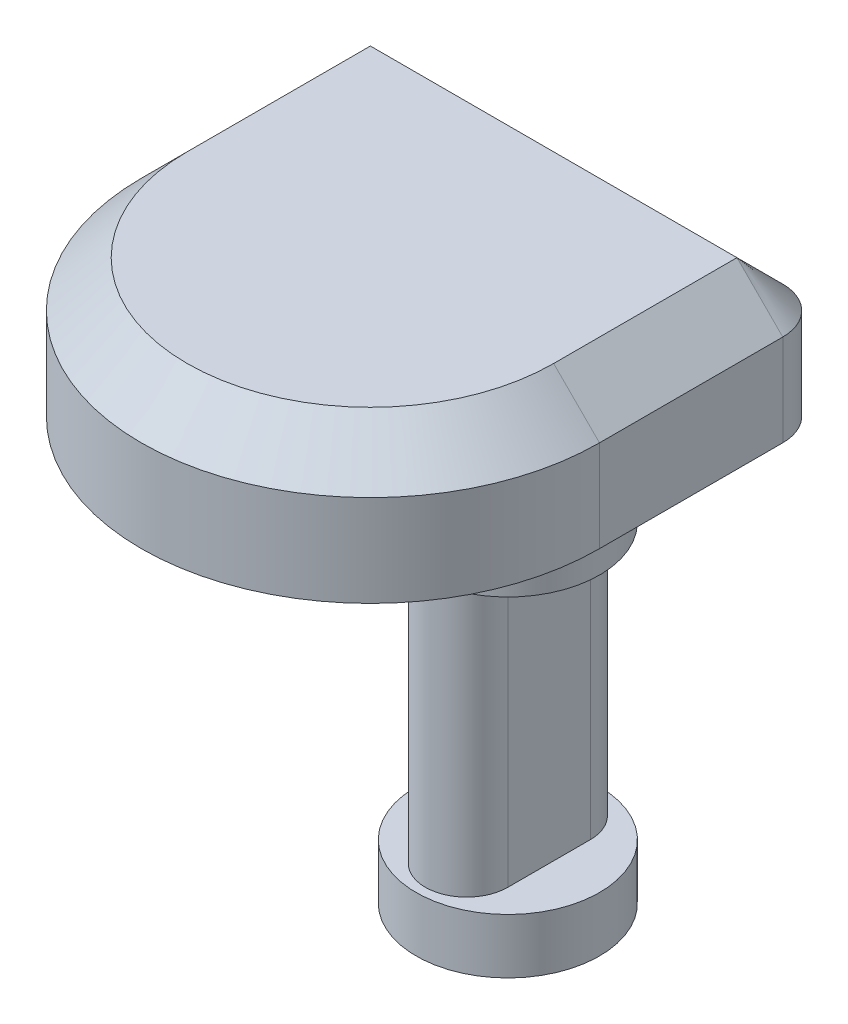
ISO-10303-21;
HEADER;
FILE_DESCRIPTION(('STEP AP214'),'2;1');
FILE_NAME('part.step','',(''),(''),'','','');
FILE_SCHEMA(('AUTOMOTIVE_DESIGN { 1 0 10303 214 1 1 1 1 }'));
ENDSEC;
DATA;
#1=APPLICATION_CONTEXT('core data for automotive mechanical design processes');
#2=APPLICATION_PROTOCOL_DEFINITION('international standard','automotive_design',2000,#1);
#3=PRODUCT_CONTEXT('',#1,'mechanical');
#4=PRODUCT('Part','Part','',(#3));
#5=PRODUCT_RELATED_PRODUCT_CATEGORY('part','',(#4));
#6=PRODUCT_DEFINITION_FORMATION('','',#4);
#7=PRODUCT_DEFINITION_CONTEXT('part definition',#1,'design');
#8=PRODUCT_DEFINITION('design','',#6,#7);
#9=PRODUCT_DEFINITION_SHAPE('','',#8);
#10=(LENGTH_UNIT() NAMED_UNIT(*) SI_UNIT(.MILLI.,.METRE.));
#11=(NAMED_UNIT(*) PLANE_ANGLE_UNIT() SI_UNIT($,.RADIAN.));
#12=(NAMED_UNIT(*) SI_UNIT($,.STERADIAN.) SOLID_ANGLE_UNIT());
#13=UNCERTAINTY_MEASURE_WITH_UNIT(LENGTH_MEASURE(1.E-05),#10,'distance_accuracy_value','');
#14=(GEOMETRIC_REPRESENTATION_CONTEXT(3) GLOBAL_UNCERTAINTY_ASSIGNED_CONTEXT((#13)) GLOBAL_UNIT_ASSIGNED_CONTEXT((#10,
#11,#12)) REPRESENTATION_CONTEXT('',''));
#15=CARTESIAN_POINT('',(0.,0.,0.));
#16=DIRECTION('',(0.,0.,1.));
#17=DIRECTION('',(1.,0.,0.));
#18=AXIS2_PLACEMENT_3D('',#15,#16,#17);
#19=CARTESIAN_POINT('',(0.,8.,-0.9));
#20=DIRECTION('',(0.,-1.,0.));
#21=DIRECTION('',(0.,0.,-1.));
#22=AXIS2_PLACEMENT_3D('',#19,#20,#21);
#23=CYLINDRICAL_SURFACE('',#22,0.9);
#24=CARTESIAN_POINT('',(0.,1.,-0.9));
#25=DIRECTION('',(0.,-1.,0.));
#26=DIRECTION('',(0.,0.,-1.));
#27=AXIS2_PLACEMENT_3D('',#24,#25,#26);
#28=CIRCLE('',#27,0.9);
#29=CARTESIAN_POINT('',(-0.9,1.,-0.9));
#30=VERTEX_POINT('',#29);
#31=CARTESIAN_POINT('',(0.9,1.,-0.900000000000001));
#32=VERTEX_POINT('',#31);
#33=EDGE_CURVE('E338',#30,#32,#28,.T.);
#34=ORIENTED_EDGE('',*,*,#33,.F.);
#35=DIRECTION('',(0.,-1.,0.));
#36=VECTOR('',#35,1.);
#37=CARTESIAN_POINT('',(-0.9,8.,-0.9));
#38=LINE('',#37,#36);
#39=CARTESIAN_POINT('',(-0.9,7.,-0.9));
#40=VERTEX_POINT('',#39);
#41=EDGE_CURVE('E373',#40,#30,#38,.T.);
#42=ORIENTED_EDGE('',*,*,#41,.F.);
#43=CARTESIAN_POINT('',(0.,7.,-0.9));
#44=DIRECTION('',(0.,1.,0.));
#45=DIRECTION('',(0.,0.,1.));
#46=AXIS2_PLACEMENT_3D('',#43,#44,#45);
#47=CIRCLE('',#46,0.9);
#48=CARTESIAN_POINT('',(0.9,7.,-0.900000000000001));
#49=VERTEX_POINT('',#48);
#50=EDGE_CURVE('E358',#49,#40,#47,.T.);
#51=ORIENTED_EDGE('',*,*,#50,.F.);
#52=DIRECTION('',(0.,-1.,0.));
#53=VECTOR('',#52,1.);
#54=CARTESIAN_POINT('',(0.9,8.,-0.900000000000001));
#55=LINE('',#54,#53);
#56=EDGE_CURVE('E362',#49,#32,#55,.T.);
#57=ORIENTED_EDGE('',*,*,#56,.T.);
#58=EDGE_LOOP('',(#34,#42,#51,#57));
#59=FACE_BOUND('',#58,.T.);
#60=ADVANCED_FACE('F41',(#59),#23,.T.);
#61=CARTESIAN_POINT('',(-0.9,8.,-0.9));
#62=DIRECTION('',(1.,0.,0.));
#63=DIRECTION('',(0.,0.,-1.));
#64=AXIS2_PLACEMENT_3D('',#61,#62,#63);
#65=PLANE('',#64);
#66=DIRECTION('',(0.,0.,-1.));
#67=VECTOR('',#66,1.);
#68=CARTESIAN_POINT('',(-0.9,1.,-0.9));
#69=LINE('',#68,#67);
#70=CARTESIAN_POINT('',(-0.9,1.,0.9));
#71=VERTEX_POINT('',#70);
#72=EDGE_CURVE('E334',#71,#30,#69,.T.);
#73=ORIENTED_EDGE('',*,*,#72,.F.);
#74=DIRECTION('',(0.,-1.,0.));
#75=VECTOR('',#74,1.);
#76=CARTESIAN_POINT('',(-0.9,8.,0.9));
#77=LINE('',#76,#75);
#78=CARTESIAN_POINT('',(-0.9,7.,0.9));
#79=VERTEX_POINT('',#78);
#80=EDGE_CURVE('E369',#79,#71,#77,.T.);
#81=ORIENTED_EDGE('',*,*,#80,.F.);
#82=DIRECTION('',(0.,0.,1.));
#83=VECTOR('',#82,1.);
#84=CARTESIAN_POINT('',(-0.9,7.,-0.9));
#85=LINE('',#84,#83);
#86=EDGE_CURVE('E354',#40,#79,#85,.T.);
#87=ORIENTED_EDGE('',*,*,#86,.F.);
#88=ORIENTED_EDGE('',*,*,#41,.T.);
#89=EDGE_LOOP('',(#73,#81,#87,#88));
#90=FACE_BOUND('',#89,.T.);
#91=ADVANCED_FACE('F490',(#90),#65,.F.);
#92=CARTESIAN_POINT('',(0.,8.,0.9));
#93=DIRECTION('',(0.,-1.,0.));
#94=DIRECTION('',(0.,0.,-1.));
#95=AXIS2_PLACEMENT_3D('',#92,#93,#94);
#96=CYLINDRICAL_SURFACE('',#95,0.9);
#97=CARTESIAN_POINT('',(0.,1.,0.9));
#98=DIRECTION('',(0.,-1.,0.));
#99=DIRECTION('',(0.,0.,-1.));
#100=AXIS2_PLACEMENT_3D('',#97,#98,#99);
#101=CIRCLE('',#100,0.9);
#102=CARTESIAN_POINT('',(0.9,1.,0.9));
#103=VERTEX_POINT('',#102);
#104=EDGE_CURVE('E330',#103,#71,#101,.T.);
#105=ORIENTED_EDGE('',*,*,#104,.F.);
#106=DIRECTION('',(0.,-1.,0.));
#107=VECTOR('',#106,1.);
#108=CARTESIAN_POINT('',(0.9,8.,0.9));
#109=LINE('',#108,#107);
#110=CARTESIAN_POINT('',(0.9,7.,0.9));
#111=VERTEX_POINT('',#110);
#112=EDGE_CURVE('E366',#111,#103,#109,.T.);
#113=ORIENTED_EDGE('',*,*,#112,.F.);
#114=CARTESIAN_POINT('',(0.,7.,0.9));
#115=DIRECTION('',(0.,1.,0.));
#116=DIRECTION('',(0.,0.,1.));
#117=AXIS2_PLACEMENT_3D('',#114,#115,#116);
#118=CIRCLE('',#117,0.9);
#119=EDGE_CURVE('E347',#79,#111,#118,.T.);
#120=ORIENTED_EDGE('',*,*,#119,.F.);
#121=ORIENTED_EDGE('',*,*,#80,.T.);
#122=EDGE_LOOP('',(#105,#113,#120,#121));
#123=FACE_BOUND('',#122,.T.);
#124=ADVANCED_FACE('F496',(#123),#96,.T.);
#125=CARTESIAN_POINT('',(0.9,8.,-0.900000000000001));
#126=DIRECTION('',(-1.,0.,0.));
#127=DIRECTION('',(0.,0.,1.));
#128=AXIS2_PLACEMENT_3D('',#125,#126,#127);
#129=PLANE('',#128);
#130=DIRECTION('',(0.,0.,1.));
#131=VECTOR('',#130,1.);
#132=CARTESIAN_POINT('',(0.9,1.,-0.900000000000001));
#133=LINE('',#132,#131);
#134=EDGE_CURVE('E381',#32,#103,#133,.T.);
#135=ORIENTED_EDGE('',*,*,#134,.F.);
#136=ORIENTED_EDGE('',*,*,#56,.F.);
#137=DIRECTION('',(0.,0.,-1.));
#138=VECTOR('',#137,1.);
#139=CARTESIAN_POINT('',(0.9,7.,-0.900000000000001));
#140=LINE('',#139,#138);
#141=EDGE_CURVE('E377',#111,#49,#140,.T.);
#142=ORIENTED_EDGE('',*,*,#141,.F.);
#143=ORIENTED_EDGE('',*,*,#112,.T.);
#144=EDGE_LOOP('',(#135,#136,#142,#143));
#145=FACE_BOUND('',#144,.T.);
#146=ADVANCED_FACE('F627',(#145),#129,.F.);
#147=CARTESIAN_POINT('',(0.,7.,0.));
#148=DIRECTION('',(0.,1.,0.));
#149=DIRECTION('',(0.,0.,1.));
#150=AXIS2_PLACEMENT_3D('',#147,#148,#149);
#151=PLANE('',#150);
#152=CARTESIAN_POINT('',(0.,7.,0.));
#153=DIRECTION('',(0.,1.,0.));
#154=DIRECTION('',(0.,0.,1.));
#155=AXIS2_PLACEMENT_3D('',#152,#153,#154);
#156=CIRCLE('',#155,2.);
#157=CARTESIAN_POINT('',(0.,7.,2.));
#158=VERTEX_POINT('',#157);
#159=EDGE_CURVE('E343',#158,#158,#156,.T.);
#160=ORIENTED_EDGE('',*,*,#159,.F.);
#161=EDGE_LOOP('',(#160));
#162=FACE_BOUND('',#161,.T.);
#163=ORIENTED_EDGE('',*,*,#141,.T.);
#164=ORIENTED_EDGE('',*,*,#50,.T.);
#165=ORIENTED_EDGE('',*,*,#86,.T.);
#166=ORIENTED_EDGE('',*,*,#119,.T.);
#167=EDGE_LOOP('',(#163,#164,#165,#166));
#168=FACE_BOUND('',#167,.T.);
#169=ADVANCED_FACE('F623',(#162,#168),#151,.F.);
#170=CARTESIAN_POINT('',(0.,7.,0.));
#171=DIRECTION('',(0.,1.,0.));
#172=DIRECTION('',(0.,0.,1.));
#173=AXIS2_PLACEMENT_3D('',#170,#171,#172);
#174=CYLINDRICAL_SURFACE('',#173,2.);
#175=ORIENTED_EDGE('',*,*,#159,.T.);
#176=EDGE_LOOP('',(#175));
#177=FACE_BOUND('',#176,.T.);
#178=CARTESIAN_POINT('',(0.,8.,0.));
#179=DIRECTION('',(0.,1.,0.));
#180=DIRECTION('',(0.,0.,1.));
#181=AXIS2_PLACEMENT_3D('',#178,#179,#180);
#182=CIRCLE('',#181,2.);
#183=CARTESIAN_POINT('',(0.,8.,2.));
#184=VERTEX_POINT('',#183);
#185=EDGE_CURVE('E342',#184,#184,#182,.T.);
#186=ORIENTED_EDGE('',*,*,#185,.F.);
#187=EDGE_LOOP('',(#186));
#188=FACE_BOUND('',#187,.T.);
#189=ADVANCED_FACE('F626',(#177,#188),#174,.T.);
#190=CARTESIAN_POINT('',(0.,8.,-0.9));
#191=DIRECTION('',(0.,1.,0.));
#192=DIRECTION('',(0.,0.,1.));
#193=AXIS2_PLACEMENT_3D('',#190,#191,#192);
#194=PLANE('',#193);
#195=CARTESIAN_POINT('',(0.,8.,0.9));
#196=DIRECTION('',(0.,1.,0.));
#197=DIRECTION('',(0.,0.,1.));
#198=AXIS2_PLACEMENT_3D('',#195,#196,#197);
#199=CIRCLE('',#198,0.9);
#200=CARTESIAN_POINT('',(-0.9,8.,0.9));
#201=VERTEX_POINT('',#200);
#202=CARTESIAN_POINT('',(0.9,8.,0.9));
#203=VERTEX_POINT('',#202);
#204=EDGE_CURVE('E274',#201,#203,#199,.T.);
#205=ORIENTED_EDGE('',*,*,#204,.F.);
#206=DIRECTION('',(0.,0.,1.));
#207=VECTOR('',#206,1.);
#208=CARTESIAN_POINT('',(-0.9,8.,0.9));
#209=LINE('',#208,#207);
#210=CARTESIAN_POINT('',(-0.9,8.,-0.9));
#211=VERTEX_POINT('',#210);
#212=EDGE_CURVE('E280',#211,#201,#209,.T.);
#213=ORIENTED_EDGE('',*,*,#212,.F.);
#214=CARTESIAN_POINT('',(0.,8.,-0.9));
#215=DIRECTION('',(0.,1.,0.));
#216=DIRECTION('',(0.,0.,1.));
#217=AXIS2_PLACEMENT_3D('',#214,#215,#216);
#218=CIRCLE('',#217,0.9);
#219=CARTESIAN_POINT('',(0.9,8.,-0.9));
#220=VERTEX_POINT('',#219);
#221=EDGE_CURVE('E300',#220,#211,#218,.T.);
#222=ORIENTED_EDGE('',*,*,#221,.F.);
#223=DIRECTION('',(0.,0.,-1.));
#224=VECTOR('',#223,1.);
#225=CARTESIAN_POINT('',(0.9,8.,0.9));
#226=LINE('',#225,#224);
#227=EDGE_CURVE('E296',#203,#220,#226,.T.);
#228=ORIENTED_EDGE('',*,*,#227,.F.);
#229=EDGE_LOOP('',(#205,#213,#222,#228));
#230=FACE_BOUND('',#229,.T.);
#231=ORIENTED_EDGE('',*,*,#185,.T.);
#232=EDGE_LOOP('',(#231));
#233=FACE_BOUND('',#232,.T.);
#234=ADVANCED_FACE('F615',(#230,#233),#194,.T.);
#235=CARTESIAN_POINT('',(0.,1.,0.));
#236=DIRECTION('',(0.,-1.,0.));
#237=DIRECTION('',(0.,0.,-1.));
#238=AXIS2_PLACEMENT_3D('',#235,#236,#237);
#239=PLANE('',#238);
#240=CARTESIAN_POINT('',(0.,1.,0.));
#241=DIRECTION('',(0.,-1.,0.));
#242=DIRECTION('',(0.,0.,-1.));
#243=AXIS2_PLACEMENT_3D('',#240,#241,#242);
#244=CIRCLE('',#243,2.);
#245=CARTESIAN_POINT('',(0.,1.,-2.));
#246=VERTEX_POINT('',#245);
#247=EDGE_CURVE('E322',#246,#246,#244,.T.);
#248=ORIENTED_EDGE('',*,*,#247,.F.);
#249=EDGE_LOOP('',(#248));
#250=FACE_BOUND('',#249,.T.);
#251=ORIENTED_EDGE('',*,*,#72,.T.);
#252=ORIENTED_EDGE('',*,*,#33,.T.);
#253=ORIENTED_EDGE('',*,*,#134,.T.);
#254=ORIENTED_EDGE('',*,*,#104,.T.);
#255=EDGE_LOOP('',(#251,#252,#253,#254));
#256=FACE_BOUND('',#255,.T.);
#257=ADVANCED_FACE('F611',(#250,#256),#239,.F.);
#258=CARTESIAN_POINT('',(0.,-0.2,0.));
#259=DIRECTION('',(0.,1.,0.));
#260=DIRECTION('',(0.,0.,1.));
#261=AXIS2_PLACEMENT_3D('',#258,#259,#260);
#262=CYLINDRICAL_SURFACE('',#261,2.);
#263=CARTESIAN_POINT('',(0.,-0.2,0.));
#264=DIRECTION('',(0.,-1.,0.));
#265=DIRECTION('',(0.,0.,-1.));
#266=AXIS2_PLACEMENT_3D('',#263,#264,#265);
#267=CIRCLE('',#266,2.);
#268=CARTESIAN_POINT('',(0.,-0.2,-2.));
#269=VERTEX_POINT('',#268);
#270=EDGE_CURVE('E326',#269,#269,#267,.T.);
#271=ORIENTED_EDGE('',*,*,#270,.F.);
#272=EDGE_LOOP('',(#271));
#273=FACE_BOUND('',#272,.T.);
#274=ORIENTED_EDGE('',*,*,#247,.T.);
#275=EDGE_LOOP('',(#274));
#276=FACE_BOUND('',#275,.T.);
#277=ADVANCED_FACE('F614',(#273,#276),#262,.T.);
#278=CARTESIAN_POINT('',(0.,-0.2,0.));
#279=DIRECTION('',(0.,-1.,0.));
#280=DIRECTION('',(0.,0.,-1.));
#281=AXIS2_PLACEMENT_3D('',#278,#279,#280);
#282=PLANE('',#281);
#283=CARTESIAN_POINT('',(-0.4,-0.2,0.));
#284=DIRECTION('',(0.,-1.,0.));
#285=DIRECTION('',(0.,0.,-1.));
#286=AXIS2_PLACEMENT_3D('',#283,#284,#285);
#287=CIRCLE('',#286,1.2);
#288=CARTESIAN_POINT('',(-0.4,-0.2,1.2));
#289=VERTEX_POINT('',#288);
#290=CARTESIAN_POINT('',(-0.4,-0.2,-1.2));
#291=VERTEX_POINT('',#290);
#292=EDGE_CURVE('E60',#289,#291,#287,.T.);
#293=ORIENTED_EDGE('',*,*,#292,.F.);
#294=DIRECTION('',(-1.,0.,0.));
#295=VECTOR('',#294,1.);
#296=CARTESIAN_POINT('',(-0.4,-0.2,1.2));
#297=LINE('',#296,#295);
#298=CARTESIAN_POINT('',(0.4,-0.2,1.2));
#299=VERTEX_POINT('',#298);
#300=EDGE_CURVE('E204',#299,#289,#297,.T.);
#301=ORIENTED_EDGE('',*,*,#300,.F.);
#302=CARTESIAN_POINT('',(0.4,-0.2,0.));
#303=DIRECTION('',(0.,-1.,0.));
#304=DIRECTION('',(0.,0.,-1.));
#305=AXIS2_PLACEMENT_3D('',#302,#303,#304);
#306=CIRCLE('',#305,1.2);
#307=CARTESIAN_POINT('',(0.400000000000001,-0.2,-1.2));
#308=VERTEX_POINT('',#307);
#309=EDGE_CURVE('E208',#308,#299,#306,.T.);
#310=ORIENTED_EDGE('',*,*,#309,.F.);
#311=DIRECTION('',(1.,0.,0.));
#312=VECTOR('',#311,1.);
#313=CARTESIAN_POINT('',(-0.4,-0.2,-1.2));
#314=LINE('',#313,#312);
#315=EDGE_CURVE('E217',#291,#308,#314,.T.);
#316=ORIENTED_EDGE('',*,*,#315,.F.);
#317=EDGE_LOOP('',(#293,#301,#310,#316));
#318=FACE_BOUND('',#317,.T.);
#319=ORIENTED_EDGE('',*,*,#270,.T.);
#320=EDGE_LOOP('',(#319));
#321=FACE_BOUND('',#320,.T.);
#322=ADVANCED_FACE('F609',(#318,#321),#282,.T.);
#323=CARTESIAN_POINT('',(0.,10.5,0.9));
#324=DIRECTION('',(0.,-1.,0.));
#325=DIRECTION('',(0.,0.,-1.));
#326=AXIS2_PLACEMENT_3D('',#323,#324,#325);
#327=CYLINDRICAL_SURFACE('',#326,0.9);
#328=ORIENTED_EDGE('',*,*,#204,.T.);
#329=DIRECTION('',(0.,-1.,0.));
#330=VECTOR('',#329,1.);
#331=CARTESIAN_POINT('',(0.9,10.5,0.9));
#332=LINE('',#331,#330);
#333=CARTESIAN_POINT('',(0.9,10.5,0.9));
#334=VERTEX_POINT('',#333);
#335=EDGE_CURVE('E318',#334,#203,#332,.T.);
#336=ORIENTED_EDGE('',*,*,#335,.F.);
#337=CARTESIAN_POINT('',(0.,10.5,0.9));
#338=DIRECTION('',(0.,1.,0.));
#339=DIRECTION('',(0.,0.,1.));
#340=AXIS2_PLACEMENT_3D('',#337,#338,#339);
#341=CIRCLE('',#340,0.9);
#342=CARTESIAN_POINT('',(-0.9,10.5,0.9));
#343=VERTEX_POINT('',#342);
#344=EDGE_CURVE('E275',#343,#334,#341,.T.);
#345=ORIENTED_EDGE('',*,*,#344,.F.);
#346=DIRECTION('',(0.,-1.,0.));
#347=VECTOR('',#346,1.);
#348=CARTESIAN_POINT('',(-0.9,10.5,0.9));
#349=LINE('',#348,#347);
#350=EDGE_CURVE('E292',#343,#201,#349,.T.);
#351=ORIENTED_EDGE('',*,*,#350,.T.);
#352=EDGE_LOOP('',(#328,#336,#345,#351));
#353=FACE_BOUND('',#352,.T.);
#354=ADVANCED_FACE('F605',(#353),#327,.T.);
#355=CARTESIAN_POINT('',(0.9,10.5,0.9));
#356=DIRECTION('',(-1.,0.,0.));
#357=DIRECTION('',(0.,0.,1.));
#358=AXIS2_PLACEMENT_3D('',#355,#356,#357);
#359=PLANE('',#358);
#360=ORIENTED_EDGE('',*,*,#227,.T.);
#361=DIRECTION('',(0.,-1.,0.));
#362=VECTOR('',#361,1.);
#363=CARTESIAN_POINT('',(0.9,10.5,-0.9));
#364=LINE('',#363,#362);
#365=CARTESIAN_POINT('',(0.9,10.5,-0.9));
#366=VERTEX_POINT('',#365);
#367=EDGE_CURVE('E314',#366,#220,#364,.T.);
#368=ORIENTED_EDGE('',*,*,#367,.F.);
#369=DIRECTION('',(0.,0.,-1.));
#370=VECTOR('',#369,1.);
#371=CARTESIAN_POINT('',(0.9,10.5,0.9));
#372=LINE('',#371,#370);
#373=EDGE_CURVE('E279',#334,#366,#372,.T.);
#374=ORIENTED_EDGE('',*,*,#373,.F.);
#375=ORIENTED_EDGE('',*,*,#335,.T.);
#376=EDGE_LOOP('',(#360,#368,#374,#375));
#377=FACE_BOUND('',#376,.T.);
#378=ADVANCED_FACE('F601',(#377),#359,.F.);
#379=CARTESIAN_POINT('',(0.,10.5,-0.9));
#380=DIRECTION('',(0.,-1.,0.));
#381=DIRECTION('',(0.,0.,-1.));
#382=AXIS2_PLACEMENT_3D('',#379,#380,#381);
#383=CYLINDRICAL_SURFACE('',#382,0.9);
#384=ORIENTED_EDGE('',*,*,#221,.T.);
#385=DIRECTION('',(0.,-1.,0.));
#386=VECTOR('',#385,1.);
#387=CARTESIAN_POINT('',(-0.9,10.5,-0.9));
#388=LINE('',#387,#386);
#389=CARTESIAN_POINT('',(-0.9,10.5,-0.9));
#390=VERTEX_POINT('',#389);
#391=EDGE_CURVE('E310',#390,#211,#388,.T.);
#392=ORIENTED_EDGE('',*,*,#391,.F.);
#393=CARTESIAN_POINT('',(0.,10.5,-0.9));
#394=DIRECTION('',(0.,1.,0.));
#395=DIRECTION('',(0.,0.,1.));
#396=AXIS2_PLACEMENT_3D('',#393,#394,#395);
#397=CIRCLE('',#396,0.9);
#398=EDGE_CURVE('E284',#366,#390,#397,.T.);
#399=ORIENTED_EDGE('',*,*,#398,.F.);
#400=ORIENTED_EDGE('',*,*,#367,.T.);
#401=EDGE_LOOP('',(#384,#392,#399,#400));
#402=FACE_BOUND('',#401,.T.);
#403=ADVANCED_FACE('F597',(#402),#383,.T.);
#404=CARTESIAN_POINT('',(-0.9,10.5,0.9));
#405=DIRECTION('',(1.,0.,0.));
#406=DIRECTION('',(0.,0.,-1.));
#407=AXIS2_PLACEMENT_3D('',#404,#405,#406);
#408=PLANE('',#407);
#409=ORIENTED_EDGE('',*,*,#212,.T.);
#410=ORIENTED_EDGE('',*,*,#350,.F.);
#411=DIRECTION('',(0.,0.,1.));
#412=VECTOR('',#411,1.);
#413=CARTESIAN_POINT('',(-0.9,10.5,0.9));
#414=LINE('',#413,#412);
#415=EDGE_CURVE('E288',#390,#343,#414,.T.);
#416=ORIENTED_EDGE('',*,*,#415,.F.);
#417=ORIENTED_EDGE('',*,*,#391,.T.);
#418=EDGE_LOOP('',(#409,#410,#416,#417));
#419=FACE_BOUND('',#418,.T.);
#420=ADVANCED_FACE('F540',(#419),#408,.F.);
#421=CARTESIAN_POINT('',(4.,13.5,-1.));
#422=DIRECTION('',(0.,-1.,0.));
#423=DIRECTION('',(0.,0.,-1.));
#424=AXIS2_PLACEMENT_3D('',#421,#422,#423);
#425=CYLINDRICAL_SURFACE('',#424,1.);
#426=DIRECTION('',(0.,-1.,0.));
#427=VECTOR('',#426,1.);
#428=CARTESIAN_POINT('',(3.99999999999999,13.5,-2.));
#429=LINE('',#428,#427);
#430=CARTESIAN_POINT('',(3.99999999999999,12.5,-2.));
#431=VERTEX_POINT('',#430);
#432=CARTESIAN_POINT('',(3.99999999999999,10.5,-2.));
#433=VERTEX_POINT('',#432);
#434=EDGE_CURVE('E271',#431,#433,#429,.T.);
#435=ORIENTED_EDGE('',*,*,#434,.F.);
#436=CARTESIAN_POINT('',(4.,12.5,-1.));
#437=DIRECTION('',(0.,-1.,0.));
#438=DIRECTION('',(0.,0.,-1.));
#439=AXIS2_PLACEMENT_3D('',#436,#437,#438);
#440=CIRCLE('',#439,1.);
#441=CARTESIAN_POINT('',(5.,12.5,-0.999999999999992));
#442=VERTEX_POINT('',#441);
#443=EDGE_CURVE('E405',#431,#442,#440,.T.);
#444=ORIENTED_EDGE('',*,*,#443,.T.);
#445=DIRECTION('',(0.,-1.,0.));
#446=VECTOR('',#445,1.);
#447=CARTESIAN_POINT('',(5.,13.5,-0.999999999999992));
#448=LINE('',#447,#446);
#449=CARTESIAN_POINT('',(5.,10.5,-0.999999999999992));
#450=VERTEX_POINT('',#449);
#451=EDGE_CURVE('E256',#442,#450,#448,.T.);
#452=ORIENTED_EDGE('',*,*,#451,.T.);
#453=CARTESIAN_POINT('',(4.,10.5,-1.));
#454=DIRECTION('',(0.,1.,0.));
#455=DIRECTION('',(0.,0.,-1.));
#456=AXIS2_PLACEMENT_3D('',#453,#454,#455);
#457=CIRCLE('',#456,1.);
#458=EDGE_CURVE('E232',#450,#433,#457,.T.);
#459=ORIENTED_EDGE('',*,*,#458,.T.);
#460=EDGE_LOOP('',(#435,#444,#452,#459));
#461=FACE_BOUND('',#460,.T.);
#462=ADVANCED_FACE('F459',(#461),#425,.T.);
#463=CARTESIAN_POINT('',(-3.99999999999999,13.5,-2.));
#464=DIRECTION('',(0.,0.,1.));
#465=DIRECTION('',(1.,0.,0.));
#466=AXIS2_PLACEMENT_3D('',#463,#464,#465);
#467=PLANE('',#466);
#468=DIRECTION('',(0.,-1.,0.));
#469=VECTOR('',#468,1.);
#470=CARTESIAN_POINT('',(-3.99999999999999,13.5,-2.));
#471=LINE('',#470,#469);
#472=CARTESIAN_POINT('',(-3.99999999999999,12.5,-2.));
#473=VERTEX_POINT('',#472);
#474=CARTESIAN_POINT('',(-3.99999999999999,10.5,-2.));
#475=VERTEX_POINT('',#474);
#476=EDGE_CURVE('E268',#473,#475,#471,.T.);
#477=ORIENTED_EDGE('',*,*,#476,.F.);
#478=DIRECTION('',(1.,0.,0.));
#479=VECTOR('',#478,1.);
#480=CARTESIAN_POINT('',(-3.99999999999999,12.5,-2.));
#481=LINE('',#480,#479);
#482=EDGE_CURVE('E398',#473,#431,#481,.T.);
#483=ORIENTED_EDGE('',*,*,#482,.T.);
#484=ORIENTED_EDGE('',*,*,#434,.T.);
#485=DIRECTION('',(-1.,0.,0.));
#486=VECTOR('',#485,1.);
#487=CARTESIAN_POINT('',(-3.99999999999999,10.5,-2.));
#488=LINE('',#487,#486);
#489=EDGE_CURVE('E236',#433,#475,#488,.T.);
#490=ORIENTED_EDGE('',*,*,#489,.T.);
#491=EDGE_LOOP('',(#477,#483,#484,#490));
#492=FACE_BOUND('',#491,.T.);
#493=ADVANCED_FACE('F468',(#492),#467,.F.);
#494=CARTESIAN_POINT('',(-4.,13.5,-1.));
#495=DIRECTION('',(0.,-1.,0.));
#496=DIRECTION('',(0.,0.,-1.));
#497=AXIS2_PLACEMENT_3D('',#494,#495,#496);
#498=CYLINDRICAL_SURFACE('',#497,1.);
#499=DIRECTION('',(0.,-1.,0.));
#500=VECTOR('',#499,1.);
#501=CARTESIAN_POINT('',(-5.,13.5,-0.999999999999992));
#502=LINE('',#501,#500);
#503=CARTESIAN_POINT('',(-5.,12.5,-0.999999999999992));
#504=VERTEX_POINT('',#503);
#505=CARTESIAN_POINT('',(-5.,10.5,-0.999999999999992));
#506=VERTEX_POINT('',#505);
#507=EDGE_CURVE('E265',#504,#506,#502,.T.);
#508=ORIENTED_EDGE('',*,*,#507,.F.);
#509=CARTESIAN_POINT('',(-4.,12.5,-1.));
#510=DIRECTION('',(0.,-1.,0.));
#511=DIRECTION('',(0.,0.,-1.));
#512=AXIS2_PLACEMENT_3D('',#509,#510,#511);
#513=CIRCLE('',#512,1.);
#514=EDGE_CURVE('E402',#504,#473,#513,.T.);
#515=ORIENTED_EDGE('',*,*,#514,.T.);
#516=ORIENTED_EDGE('',*,*,#476,.T.);
#517=CARTESIAN_POINT('',(-4.,10.5,-1.));
#518=DIRECTION('',(0.,1.,0.));
#519=DIRECTION('',(0.,0.,-1.));
#520=AXIS2_PLACEMENT_3D('',#517,#518,#519);
#521=CIRCLE('',#520,1.);
#522=EDGE_CURVE('E240',#475,#506,#521,.T.);
#523=ORIENTED_EDGE('',*,*,#522,.T.);
#524=EDGE_LOOP('',(#508,#515,#516,#523));
#525=FACE_BOUND('',#524,.T.);
#526=ADVANCED_FACE('F557',(#525),#498,.T.);
#527=CARTESIAN_POINT('',(-5.,13.5,3.));
#528=DIRECTION('',(1.,0.,0.));
#529=DIRECTION('',(0.,0.,-1.));
#530=AXIS2_PLACEMENT_3D('',#527,#528,#529);
#531=PLANE('',#530);
#532=DIRECTION('',(0.,-1.,0.));
#533=VECTOR('',#532,1.);
#534=CARTESIAN_POINT('',(-5.,13.5,3.));
#535=LINE('',#534,#533);
#536=CARTESIAN_POINT('',(-5.,12.5,3.));
#537=VERTEX_POINT('',#536);
#538=CARTESIAN_POINT('',(-5.,10.5,3.));
#539=VERTEX_POINT('',#538);
#540=EDGE_CURVE('E262',#537,#539,#535,.T.);
#541=ORIENTED_EDGE('',*,*,#540,.F.);
#542=DIRECTION('',(0.,0.,-1.));
#543=VECTOR('',#542,1.);
#544=CARTESIAN_POINT('',(-5.,12.5,3.));
#545=LINE('',#544,#543);
#546=EDGE_CURVE('E408',#537,#504,#545,.T.);
#547=ORIENTED_EDGE('',*,*,#546,.T.);
#548=ORIENTED_EDGE('',*,*,#507,.T.);
#549=DIRECTION('',(0.,0.,1.));
#550=VECTOR('',#549,1.);
#551=CARTESIAN_POINT('',(-5.,10.5,3.));
#552=LINE('',#551,#550);
#553=EDGE_CURVE('E244',#506,#539,#552,.T.);
#554=ORIENTED_EDGE('',*,*,#553,.T.);
#555=EDGE_LOOP('',(#541,#547,#548,#554));
#556=FACE_BOUND('',#555,.T.);
#557=ADVANCED_FACE('F446',(#556),#531,.F.);
#558=CARTESIAN_POINT('',(0.,13.5,3.));
#559=DIRECTION('',(0.,-1.,0.));
#560=DIRECTION('',(0.,0.,-1.));
#561=AXIS2_PLACEMENT_3D('',#558,#559,#560);
#562=CYLINDRICAL_SURFACE('',#561,5.);
#563=DIRECTION('',(0.,-1.,0.));
#564=VECTOR('',#563,1.);
#565=CARTESIAN_POINT('',(5.,13.5,3.));
#566=LINE('',#565,#564);
#567=CARTESIAN_POINT('',(5.,12.5,3.));
#568=VERTEX_POINT('',#567);
#569=CARTESIAN_POINT('',(5.,10.5,3.));
#570=VERTEX_POINT('',#569);
#571=EDGE_CURVE('E259',#568,#570,#566,.T.);
#572=ORIENTED_EDGE('',*,*,#571,.F.);
#573=CARTESIAN_POINT('',(0.,12.5,3.));
#574=DIRECTION('',(0.,-1.,0.));
#575=DIRECTION('',(0.,0.,-1.));
#576=AXIS2_PLACEMENT_3D('',#573,#574,#575);
#577=CIRCLE('',#576,5.);
#578=EDGE_CURVE('E11',#568,#537,#577,.T.);
#579=ORIENTED_EDGE('',*,*,#578,.T.);
#580=ORIENTED_EDGE('',*,*,#540,.T.);
#581=CARTESIAN_POINT('',(0.,10.5,3.));
#582=DIRECTION('',(0.,1.,0.));
#583=DIRECTION('',(0.,0.,1.));
#584=AXIS2_PLACEMENT_3D('',#581,#582,#583);
#585=CIRCLE('',#584,5.);
#586=EDGE_CURVE('E248',#539,#570,#585,.T.);
#587=ORIENTED_EDGE('',*,*,#586,.T.);
#588=EDGE_LOOP('',(#572,#579,#580,#587));
#589=FACE_BOUND('',#588,.T.);
#590=ADVANCED_FACE('F444',(#589),#562,.T.);
#591=CARTESIAN_POINT('',(5.,13.5,3.));
#592=DIRECTION('',(-1.,0.,0.));
#593=DIRECTION('',(0.,0.,1.));
#594=AXIS2_PLACEMENT_3D('',#591,#592,#593);
#595=PLANE('',#594);
#596=ORIENTED_EDGE('',*,*,#451,.F.);
#597=DIRECTION('',(0.,0.,1.));
#598=VECTOR('',#597,1.);
#599=CARTESIAN_POINT('',(5.,12.5,3.));
#600=LINE('',#599,#598);
#601=EDGE_CURVE('E52',#442,#568,#600,.T.);
#602=ORIENTED_EDGE('',*,*,#601,.T.);
#603=ORIENTED_EDGE('',*,*,#571,.T.);
#604=DIRECTION('',(0.,0.,-1.));
#605=VECTOR('',#604,1.);
#606=CARTESIAN_POINT('',(5.,10.5,3.));
#607=LINE('',#606,#605);
#608=EDGE_CURVE('E252',#570,#450,#607,.T.);
#609=ORIENTED_EDGE('',*,*,#608,.T.);
#610=EDGE_LOOP('',(#596,#602,#603,#609));
#611=FACE_BOUND('',#610,.T.);
#612=ADVANCED_FACE('F456',(#611),#595,.F.);
#613=CARTESIAN_POINT('',(4.,13.5,-1.));
#614=DIRECTION('',(0.,-1.,0.));
#615=DIRECTION('',(0.,0.,-1.));
#616=AXIS2_PLACEMENT_3D('',#613,#614,#615);
#617=PLANE('',#616);
#618=DIRECTION('',(0.,0.,-1.));
#619=VECTOR('',#618,1.);
#620=CARTESIAN_POINT('',(4.,13.5,-1.));
#621=LINE('',#620,#619);
#622=CARTESIAN_POINT('',(4.,13.5,3.));
#623=VERTEX_POINT('',#622);
#624=CARTESIAN_POINT('',(4.,13.5,-1.));
#625=VERTEX_POINT('',#624);
#626=EDGE_CURVE('E388',#623,#625,#621,.T.);
#627=ORIENTED_EDGE('',*,*,#626,.T.);
#628=DIRECTION('',(-1.,0.,0.));
#629=VECTOR('',#628,1.);
#630=CARTESIAN_POINT('',(4.,13.5,-1.));
#631=LINE('',#630,#629);
#632=CARTESIAN_POINT('',(-4.00000000000001,13.5,-1.));
#633=VERTEX_POINT('',#632);
#634=EDGE_CURVE('E394',#625,#633,#631,.T.);
#635=ORIENTED_EDGE('',*,*,#634,.T.);
#636=DIRECTION('',(0.,0.,1.));
#637=VECTOR('',#636,1.);
#638=CARTESIAN_POINT('',(-4.00000000000001,13.5,-1.));
#639=LINE('',#638,#637);
#640=CARTESIAN_POINT('',(-4.00000000000001,13.5,3.));
#641=VERTEX_POINT('',#640);
#642=EDGE_CURVE('E391',#633,#641,#639,.T.);
#643=ORIENTED_EDGE('',*,*,#642,.T.);
#644=CARTESIAN_POINT('',(0.,13.5,3.));
#645=DIRECTION('',(0.,-1.,0.));
#646=DIRECTION('',(0.,0.,-1.));
#647=AXIS2_PLACEMENT_3D('',#644,#645,#646);
#648=CIRCLE('',#647,4.00000000000001);
#649=EDGE_CURVE('E385',#641,#623,#648,.F.);
#650=ORIENTED_EDGE('',*,*,#649,.T.);
#651=EDGE_LOOP('',(#627,#635,#643,#650));
#652=FACE_BOUND('',#651,.T.);
#653=ADVANCED_FACE('F478',(#652),#617,.F.);
#654=CARTESIAN_POINT('',(4.,10.5,-1.));
#655=DIRECTION('',(0.,-1.,0.));
#656=DIRECTION('',(0.,0.,-1.));
#657=AXIS2_PLACEMENT_3D('',#654,#655,#656);
#658=PLANE('',#657);
#659=ORIENTED_EDGE('',*,*,#415,.T.);
#660=ORIENTED_EDGE('',*,*,#344,.T.);
#661=ORIENTED_EDGE('',*,*,#373,.T.);
#662=ORIENTED_EDGE('',*,*,#398,.T.);
#663=EDGE_LOOP('',(#659,#660,#661,#662));
#664=FACE_BOUND('',#663,.T.);
#665=ORIENTED_EDGE('',*,*,#458,.F.);
#666=ORIENTED_EDGE('',*,*,#608,.F.);
#667=ORIENTED_EDGE('',*,*,#586,.F.);
#668=ORIENTED_EDGE('',*,*,#553,.F.);
#669=ORIENTED_EDGE('',*,*,#522,.F.);
#670=ORIENTED_EDGE('',*,*,#489,.F.);
#671=EDGE_LOOP('',(#665,#666,#667,#668,#669,#670));
#672=FACE_BOUND('',#671,.T.);
#673=ADVANCED_FACE('F454',(#664,#672),#658,.T.);
#674=CARTESIAN_POINT('',(0.,13.5,3.));
#675=DIRECTION('',(0.,-1.,0.));
#676=DIRECTION('',(0.,0.,-1.));
#677=AXIS2_PLACEMENT_3D('',#674,#675,#676);
#678=CONICAL_SURFACE('',#677,4.00000000000001,0.785398163397444);
#679=DIRECTION('',(0.707106781186544,0.707106781186551,0.));
#680=VECTOR('',#679,1.);
#681=CARTESIAN_POINT('',(-5.,12.5,3.));
#682=LINE('',#681,#680);
#683=EDGE_CURVE('E425',#537,#641,#682,.T.);
#684=ORIENTED_EDGE('',*,*,#683,.F.);
#685=ORIENTED_EDGE('',*,*,#578,.F.);
#686=DIRECTION('',(0.707106781186544,-0.707106781186551,0.));
#687=VECTOR('',#686,1.);
#688=CARTESIAN_POINT('',(4.,13.5,3.));
#689=LINE('',#688,#687);
#690=EDGE_CURVE('E46',#623,#568,#689,.T.);
#691=ORIENTED_EDGE('',*,*,#690,.F.);
#692=ORIENTED_EDGE('',*,*,#649,.F.);
#693=EDGE_LOOP('',(#684,#685,#691,#692));
#694=FACE_BOUND('',#693,.T.);
#695=ADVANCED_FACE('F44',(#694),#678,.T.);
#696=CARTESIAN_POINT('',(4.,13.5,-1.));
#697=DIRECTION('',(-0.707106781186549,-0.707106781186546,0.));
#698=DIRECTION('',(0.,0.,-1.));
#699=AXIS2_PLACEMENT_3D('',#696,#697,#698);
#700=PLANE('',#699);
#701=ORIENTED_EDGE('',*,*,#690,.T.);
#702=ORIENTED_EDGE('',*,*,#601,.F.);
#703=DIRECTION('',(0.707106781186546,-0.707106781186549,0.));
#704=VECTOR('',#703,1.);
#705=CARTESIAN_POINT('',(4.,13.5,-1.));
#706=LINE('',#705,#704);
#707=EDGE_CURVE('E422',#625,#442,#706,.T.);
#708=ORIENTED_EDGE('',*,*,#707,.F.);
#709=ORIENTED_EDGE('',*,*,#626,.F.);
#710=EDGE_LOOP('',(#701,#702,#708,#709));
#711=FACE_BOUND('',#710,.T.);
#712=ADVANCED_FACE('F437',(#711),#700,.F.);
#713=CARTESIAN_POINT('',(-4.00000000000001,13.5,-1.));
#714=DIRECTION('',(0.707106781186551,-0.707106781186544,0.));
#715=DIRECTION('',(0.,0.,1.));
#716=AXIS2_PLACEMENT_3D('',#713,#714,#715);
#717=PLANE('',#716);
#718=ORIENTED_EDGE('',*,*,#683,.T.);
#719=ORIENTED_EDGE('',*,*,#642,.F.);
#720=DIRECTION('',(0.707106781186544,0.707106781186551,0.));
#721=VECTOR('',#720,1.);
#722=CARTESIAN_POINT('',(-5.,12.5,-0.999999999999992));
#723=LINE('',#722,#721);
#724=EDGE_CURVE('E418',#504,#633,#723,.T.);
#725=ORIENTED_EDGE('',*,*,#724,.F.);
#726=ORIENTED_EDGE('',*,*,#546,.F.);
#727=EDGE_LOOP('',(#718,#719,#725,#726));
#728=FACE_BOUND('',#727,.T.);
#729=ADVANCED_FACE('F476',(#728),#717,.F.);
#730=CARTESIAN_POINT('',(4.,12.5,-1.));
#731=DIRECTION('',(0.,-1.,0.));
#732=DIRECTION('',(0.,0.,-1.));
#733=AXIS2_PLACEMENT_3D('',#730,#731,#732);
#734=CONICAL_SURFACE('',#733,0.999999999999996,0.785398163397444);
#735=ORIENTED_EDGE('',*,*,#707,.T.);
#736=ORIENTED_EDGE('',*,*,#443,.F.);
#737=DIRECTION('',(0.,-0.707106781186549,-0.707106781186546));
#738=VECTOR('',#737,1.);
#739=CARTESIAN_POINT('',(3.99999999999999,13.5,-1.));
#740=LINE('',#739,#738);
#741=EDGE_CURVE('E415',#625,#431,#740,.T.);
#742=ORIENTED_EDGE('',*,*,#741,.F.);
#743=EDGE_LOOP('',(#735,#736,#742));
#744=FACE_BOUND('',#743,.T.);
#745=ADVANCED_FACE('F463',(#744),#734,.T.);
#746=CARTESIAN_POINT('',(-4.,12.5,-1.));
#747=DIRECTION('',(0.,-1.,0.));
#748=DIRECTION('',(0.,0.,-1.));
#749=AXIS2_PLACEMENT_3D('',#746,#747,#748);
#750=CONICAL_SURFACE('',#749,0.999999999999996,0.785398163397444);
#751=ORIENTED_EDGE('',*,*,#514,.F.);
#752=ORIENTED_EDGE('',*,*,#724,.T.);
#753=DIRECTION('',(0.,0.707106781186549,0.707106781186546));
#754=VECTOR('',#753,1.);
#755=CARTESIAN_POINT('',(-3.99999999999999,12.5,-2.));
#756=LINE('',#755,#754);
#757=EDGE_CURVE('E226',#473,#633,#756,.T.);
#758=ORIENTED_EDGE('',*,*,#757,.F.);
#759=EDGE_LOOP('',(#751,#752,#758));
#760=FACE_BOUND('',#759,.T.);
#761=ADVANCED_FACE('F474',(#760),#750,.T.);
#762=CARTESIAN_POINT('',(4.,13.5,-1.));
#763=DIRECTION('',(0.,-0.707106781186546,0.707106781186549));
#764=DIRECTION('',(-1.,0.,0.));
#765=AXIS2_PLACEMENT_3D('',#762,#763,#764);
#766=PLANE('',#765);
#767=ORIENTED_EDGE('',*,*,#741,.T.);
#768=ORIENTED_EDGE('',*,*,#482,.F.);
#769=ORIENTED_EDGE('',*,*,#757,.T.);
#770=ORIENTED_EDGE('',*,*,#634,.F.);
#771=EDGE_LOOP('',(#767,#768,#769,#770));
#772=FACE_BOUND('',#771,.T.);
#773=ADVANCED_FACE('F471',(#772),#766,.F.);
#774=CARTESIAN_POINT('',(-0.4,0.,0.));
#775=DIRECTION('',(0.,-1.,0.));
#776=DIRECTION('',(0.,0.,-1.));
#777=AXIS2_PLACEMENT_3D('',#774,#775,#776);
#778=CYLINDRICAL_SURFACE('',#777,1.2);
#779=ORIENTED_EDGE('',*,*,#292,.T.);
#780=DIRECTION('',(0.,-1.,0.));
#781=VECTOR('',#780,1.);
#782=CARTESIAN_POINT('',(-0.4,0.,-1.2));
#783=LINE('',#782,#781);
#784=CARTESIAN_POINT('',(-0.4,0.,-1.2));
#785=VERTEX_POINT('',#784);
#786=EDGE_CURVE('E179',#785,#291,#783,.T.);
#787=ORIENTED_EDGE('',*,*,#786,.F.);
#788=CARTESIAN_POINT('',(-0.4,0.,0.));
#789=DIRECTION('',(0.,-1.,0.));
#790=DIRECTION('',(0.,0.,-1.));
#791=AXIS2_PLACEMENT_3D('',#788,#789,#790);
#792=CIRCLE('',#791,1.2);
#793=CARTESIAN_POINT('',(-0.4,0.,1.2));
#794=VERTEX_POINT('',#793);
#795=EDGE_CURVE('E183',#794,#785,#792,.T.);
#796=ORIENTED_EDGE('',*,*,#795,.F.);
#797=DIRECTION('',(0.,-1.,0.));
#798=VECTOR('',#797,1.);
#799=CARTESIAN_POINT('',(-0.4,0.,1.2));
#800=LINE('',#799,#798);
#801=EDGE_CURVE('E223',#794,#289,#800,.T.);
#802=ORIENTED_EDGE('',*,*,#801,.T.);
#803=EDGE_LOOP('',(#779,#787,#796,#802));
#804=FACE_BOUND('',#803,.T.);
#805=ADVANCED_FACE('F181',(#804),#778,.F.);
#806=CARTESIAN_POINT('',(-0.4,0.,1.2));
#807=DIRECTION('',(0.,0.,1.));
#808=DIRECTION('',(1.,0.,0.));
#809=AXIS2_PLACEMENT_3D('',#806,#807,#808);
#810=PLANE('',#809);
#811=ORIENTED_EDGE('',*,*,#300,.T.);
#812=ORIENTED_EDGE('',*,*,#801,.F.);
#813=DIRECTION('',(-1.,0.,0.));
#814=VECTOR('',#813,1.);
#815=CARTESIAN_POINT('',(-0.4,0.,1.2));
#816=LINE('',#815,#814);
#817=CARTESIAN_POINT('',(0.4,0.,1.2));
#818=VERTEX_POINT('',#817);
#819=EDGE_CURVE('E190',#818,#794,#816,.T.);
#820=ORIENTED_EDGE('',*,*,#819,.F.);
#821=DIRECTION('',(0.,-1.,0.));
#822=VECTOR('',#821,1.);
#823=CARTESIAN_POINT('',(0.4,0.,1.2));
#824=LINE('',#823,#822);
#825=EDGE_CURVE('E227',#818,#299,#824,.T.);
#826=ORIENTED_EDGE('',*,*,#825,.T.);
#827=EDGE_LOOP('',(#811,#812,#820,#826));
#828=FACE_BOUND('',#827,.T.);
#829=ADVANCED_FACE('F736',(#828),#810,.F.);
#830=CARTESIAN_POINT('',(0.4,0.,0.));
#831=DIRECTION('',(0.,-1.,0.));
#832=DIRECTION('',(0.,0.,-1.));
#833=AXIS2_PLACEMENT_3D('',#830,#831,#832);
#834=CYLINDRICAL_SURFACE('',#833,1.2);
#835=ORIENTED_EDGE('',*,*,#309,.T.);
#836=ORIENTED_EDGE('',*,*,#825,.F.);
#837=CARTESIAN_POINT('',(0.4,0.,0.));
#838=DIRECTION('',(0.,-1.,0.));
#839=DIRECTION('',(0.,0.,-1.));
#840=AXIS2_PLACEMENT_3D('',#837,#838,#839);
#841=CIRCLE('',#840,1.2);
#842=CARTESIAN_POINT('',(0.400000000000001,0.,-1.2));
#843=VERTEX_POINT('',#842);
#844=EDGE_CURVE('E199',#843,#818,#841,.T.);
#845=ORIENTED_EDGE('',*,*,#844,.F.);
#846=DIRECTION('',(0.,-1.,0.));
#847=VECTOR('',#846,1.);
#848=CARTESIAN_POINT('',(0.400000000000001,0.,-1.2));
#849=LINE('',#848,#847);
#850=EDGE_CURVE('E189',#843,#308,#849,.T.);
#851=ORIENTED_EDGE('',*,*,#850,.T.);
#852=EDGE_LOOP('',(#835,#836,#845,#851));
#853=FACE_BOUND('',#852,.T.);
#854=ADVANCED_FACE('F744',(#853),#834,.F.);
#855=CARTESIAN_POINT('',(-0.4,0.,-1.2));
#856=DIRECTION('',(0.,0.,-1.));
#857=DIRECTION('',(-1.,0.,0.));
#858=AXIS2_PLACEMENT_3D('',#855,#856,#857);
#859=PLANE('',#858);
#860=ORIENTED_EDGE('',*,*,#315,.T.);
#861=ORIENTED_EDGE('',*,*,#850,.F.);
#862=DIRECTION('',(1.,0.,0.));
#863=VECTOR('',#862,1.);
#864=CARTESIAN_POINT('',(-0.4,0.,-1.2));
#865=LINE('',#864,#863);
#866=EDGE_CURVE('E193',#785,#843,#865,.T.);
#867=ORIENTED_EDGE('',*,*,#866,.F.);
#868=ORIENTED_EDGE('',*,*,#786,.T.);
#869=EDGE_LOOP('',(#860,#861,#867,#868));
#870=FACE_BOUND('',#869,.T.);
#871=ADVANCED_FACE('F194',(#870),#859,.F.);
#872=CARTESIAN_POINT('',(-0.4,0.,0.));
#873=DIRECTION('',(0.,-1.,0.));
#874=DIRECTION('',(0.,0.,-1.));
#875=AXIS2_PLACEMENT_3D('',#872,#873,#874);
#876=PLANE('',#875);
#877=ORIENTED_EDGE('',*,*,#795,.T.);
#878=ORIENTED_EDGE('',*,*,#866,.T.);
#879=ORIENTED_EDGE('',*,*,#844,.T.);
#880=ORIENTED_EDGE('',*,*,#819,.T.);
#881=EDGE_LOOP('',(#877,#878,#879,#880));
#882=FACE_BOUND('',#881,.T.);
#883=ADVANCED_FACE('F201',(#882),#876,.T.);
#884=CLOSED_SHELL('',(#60,#91,#124,#146,#169,#189,#234,#257,#277,#322,#354,#378,#403,#420,#462,
#493,#526,#557,#590,#612,#653,#673,#695,#712,#729,#745,#761,#773,#805,#829,#854,#871,#883));
#885=MANIFOLD_SOLID_BREP('B2',#884);
#886=ADVANCED_BREP_SHAPE_REPRESENTATION('',(#18,#885),#14);
#887=SHAPE_DEFINITION_REPRESENTATION(#9,#886);
ENDSEC;
END-ISO-10303-21;
